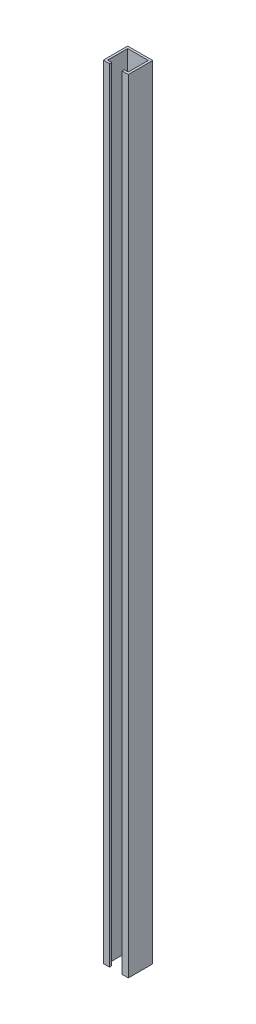
ISO-10303-21;
HEADER;
FILE_DESCRIPTION(('STEP AP214'),'2;1');
FILE_NAME('part.step','',(''),(''),'','','');
FILE_SCHEMA(('AUTOMOTIVE_DESIGN { 1 0 10303 214 1 1 1 1 }'));
ENDSEC;
DATA;
#1=APPLICATION_CONTEXT('core data for automotive mechanical design processes');
#2=APPLICATION_PROTOCOL_DEFINITION('international standard','automotive_design',2000,#1);
#3=PRODUCT_CONTEXT('',#1,'mechanical');
#4=PRODUCT('Part','Part','',(#3));
#5=PRODUCT_RELATED_PRODUCT_CATEGORY('part','',(#4));
#6=PRODUCT_DEFINITION_FORMATION('','',#4);
#7=PRODUCT_DEFINITION_CONTEXT('part definition',#1,'design');
#8=PRODUCT_DEFINITION('design','',#6,#7);
#9=PRODUCT_DEFINITION_SHAPE('','',#8);
#10=(LENGTH_UNIT() NAMED_UNIT(*) SI_UNIT(.MILLI.,.METRE.));
#11=(NAMED_UNIT(*) PLANE_ANGLE_UNIT() SI_UNIT($,.RADIAN.));
#12=(NAMED_UNIT(*) SI_UNIT($,.STERADIAN.) SOLID_ANGLE_UNIT());
#13=UNCERTAINTY_MEASURE_WITH_UNIT(LENGTH_MEASURE(1.E-05),#10,'distance_accuracy_value','');
#14=(GEOMETRIC_REPRESENTATION_CONTEXT(3) GLOBAL_UNCERTAINTY_ASSIGNED_CONTEXT((#13)) GLOBAL_UNIT_ASSIGNED_CONTEXT((#10,
#11,#12)) REPRESENTATION_CONTEXT('',''));
#15=CARTESIAN_POINT('',(0.,0.,0.));
#16=DIRECTION('',(0.,0.,1.));
#17=DIRECTION('',(1.,0.,0.));
#18=AXIS2_PLACEMENT_3D('',#15,#16,#17);
#19=CARTESIAN_POINT('',(9.5,360.,-20.4566609030179));
#20=DIRECTION('',(1.,0.,0.));
#21=DIRECTION('',(0.,0.,-1.));
#22=AXIS2_PLACEMENT_3D('',#19,#20,#21);
#23=PLANE('',#22);
#24=DIRECTION('',(0.,0.,1.));
#25=VECTOR('',#24,1.);
#26=CARTESIAN_POINT('',(9.5,-360.,-20.4566609030179));
#27=LINE('',#26,#25);
#28=CARTESIAN_POINT('',(9.5,-360.,-20.4566609030179));
#29=VERTEX_POINT('',#28);
#30=CARTESIAN_POINT('',(9.5,-360.,-2.));
#31=VERTEX_POINT('',#30);
#32=EDGE_CURVE('E164',#29,#31,#27,.T.);
#33=ORIENTED_EDGE('',*,*,#32,.T.);
#34=DIRECTION('',(0.,-1.,0.));
#35=VECTOR('',#34,1.);
#36=CARTESIAN_POINT('',(9.5,360.,-2.));
#37=LINE('',#36,#35);
#38=CARTESIAN_POINT('',(9.5,360.,-2.));
#39=VERTEX_POINT('',#38);
#40=EDGE_CURVE('E11',#39,#31,#37,.T.);
#41=ORIENTED_EDGE('',*,*,#40,.F.);
#42=DIRECTION('',(0.,0.,1.));
#43=VECTOR('',#42,1.);
#44=CARTESIAN_POINT('',(9.5,360.,-20.4566609030179));
#45=LINE('',#44,#43);
#46=CARTESIAN_POINT('',(9.5,360.,-20.4566609030179));
#47=VERTEX_POINT('',#46);
#48=EDGE_CURVE('E198',#47,#39,#45,.T.);
#49=ORIENTED_EDGE('',*,*,#48,.F.);
#50=DIRECTION('',(0.,-1.,0.));
#51=VECTOR('',#50,1.);
#52=CARTESIAN_POINT('',(9.5,360.,-20.4566609030179));
#53=LINE('',#52,#51);
#54=EDGE_CURVE('E160',#47,#29,#53,.T.);
#55=ORIENTED_EDGE('',*,*,#54,.T.);
#56=EDGE_LOOP('',(#33,#41,#49,#55));
#57=FACE_BOUND('',#56,.T.);
#58=ADVANCED_FACE('F39',(#57),#23,.F.);
#59=CARTESIAN_POINT('',(9.5,360.,-2.));
#60=DIRECTION('',(0.,0.,1.));
#61=DIRECTION('',(1.,0.,0.));
#62=AXIS2_PLACEMENT_3D('',#59,#60,#61);
#63=PLANE('',#62);
#64=DIRECTION('',(-1.,0.,0.));
#65=VECTOR('',#64,1.);
#66=CARTESIAN_POINT('',(9.5,-360.,-2.));
#67=LINE('',#66,#65);
#68=CARTESIAN_POINT('',(5.75,-360.,-2.));
#69=VERTEX_POINT('',#68);
#70=EDGE_CURVE('E168',#31,#69,#67,.T.);
#71=ORIENTED_EDGE('',*,*,#70,.T.);
#72=DIRECTION('',(0.,-1.,0.));
#73=VECTOR('',#72,1.);
#74=CARTESIAN_POINT('',(5.75,360.,-2.));
#75=LINE('',#74,#73);
#76=CARTESIAN_POINT('',(5.75,360.,-2.));
#77=VERTEX_POINT('',#76);
#78=EDGE_CURVE('E48',#77,#69,#75,.T.);
#79=ORIENTED_EDGE('',*,*,#78,.F.);
#80=DIRECTION('',(-1.,0.,0.));
#81=VECTOR('',#80,1.);
#82=CARTESIAN_POINT('',(9.5,360.,-2.));
#83=LINE('',#82,#81);
#84=EDGE_CURVE('E111',#39,#77,#83,.T.);
#85=ORIENTED_EDGE('',*,*,#84,.F.);
#86=ORIENTED_EDGE('',*,*,#40,.T.);
#87=EDGE_LOOP('',(#71,#79,#85,#86));
#88=FACE_BOUND('',#87,.T.);
#89=ADVANCED_FACE('F292',(#88),#63,.F.);
#90=CARTESIAN_POINT('',(5.75,360.,0.));
#91=DIRECTION('',(1.,0.,0.));
#92=DIRECTION('',(0.,0.,-1.));
#93=AXIS2_PLACEMENT_3D('',#90,#91,#92);
#94=PLANE('',#93);
#95=DIRECTION('',(0.,0.,1.));
#96=VECTOR('',#95,1.);
#97=CARTESIAN_POINT('',(5.75,-360.,0.));
#98=LINE('',#97,#96);
#99=CARTESIAN_POINT('',(5.75,-360.,0.));
#100=VERTEX_POINT('',#99);
#101=EDGE_CURVE('E171',#69,#100,#98,.T.);
#102=ORIENTED_EDGE('',*,*,#101,.T.);
#103=DIRECTION('',(0.,-1.,0.));
#104=VECTOR('',#103,1.);
#105=CARTESIAN_POINT('',(5.75,360.,0.));
#106=LINE('',#105,#104);
#107=CARTESIAN_POINT('',(5.75,360.,0.));
#108=VERTEX_POINT('',#107);
#109=EDGE_CURVE('E225',#108,#100,#106,.T.);
#110=ORIENTED_EDGE('',*,*,#109,.F.);
#111=DIRECTION('',(0.,0.,1.));
#112=VECTOR('',#111,1.);
#113=CARTESIAN_POINT('',(5.75,360.,0.));
#114=LINE('',#113,#112);
#115=EDGE_CURVE('E235',#77,#108,#114,.T.);
#116=ORIENTED_EDGE('',*,*,#115,.F.);
#117=ORIENTED_EDGE('',*,*,#78,.T.);
#118=EDGE_LOOP('',(#102,#110,#116,#117));
#119=FACE_BOUND('',#118,.T.);
#120=ADVANCED_FACE('F233',(#119),#94,.F.);
#121=CARTESIAN_POINT('',(11.5,360.,0.));
#122=DIRECTION('',(0.,0.,-1.));
#123=DIRECTION('',(-1.,0.,0.));
#124=AXIS2_PLACEMENT_3D('',#121,#122,#123);
#125=PLANE('',#124);
#126=DIRECTION('',(1.,0.,0.));
#127=VECTOR('',#126,1.);
#128=CARTESIAN_POINT('',(11.5,-360.,0.));
#129=LINE('',#128,#127);
#130=CARTESIAN_POINT('',(11.5,-360.,0.));
#131=VERTEX_POINT('',#130);
#132=EDGE_CURVE('E174',#100,#131,#129,.T.);
#133=ORIENTED_EDGE('',*,*,#132,.T.);
#134=DIRECTION('',(0.,-1.,0.));
#135=VECTOR('',#134,1.);
#136=CARTESIAN_POINT('',(11.5,360.,0.));
#137=LINE('',#136,#135);
#138=CARTESIAN_POINT('',(11.5,360.,0.));
#139=VERTEX_POINT('',#138);
#140=EDGE_CURVE('E221',#139,#131,#137,.T.);
#141=ORIENTED_EDGE('',*,*,#140,.F.);
#142=DIRECTION('',(1.,0.,0.));
#143=VECTOR('',#142,1.);
#144=CARTESIAN_POINT('',(11.5,360.,0.));
#145=LINE('',#144,#143);
#146=EDGE_CURVE('E254',#108,#139,#145,.T.);
#147=ORIENTED_EDGE('',*,*,#146,.F.);
#148=ORIENTED_EDGE('',*,*,#109,.T.);
#149=EDGE_LOOP('',(#133,#141,#147,#148));
#150=FACE_BOUND('',#149,.T.);
#151=ADVANCED_FACE('F244',(#150),#125,.F.);
#152=CARTESIAN_POINT('',(11.5,360.,-22.4566609030179));
#153=DIRECTION('',(-1.,0.,0.));
#154=DIRECTION('',(0.,0.,1.));
#155=AXIS2_PLACEMENT_3D('',#152,#153,#154);
#156=PLANE('',#155);
#157=DIRECTION('',(0.,0.,-1.));
#158=VECTOR('',#157,1.);
#159=CARTESIAN_POINT('',(11.5,-360.,-22.4566609030179));
#160=LINE('',#159,#158);
#161=CARTESIAN_POINT('',(11.5,-360.,-22.4566609030179));
#162=VERTEX_POINT('',#161);
#163=EDGE_CURVE('E177',#131,#162,#160,.T.);
#164=ORIENTED_EDGE('',*,*,#163,.T.);
#165=DIRECTION('',(0.,-1.,0.));
#166=VECTOR('',#165,1.);
#167=CARTESIAN_POINT('',(11.5,360.,-22.4566609030179));
#168=LINE('',#167,#166);
#169=CARTESIAN_POINT('',(11.5,360.,-22.4566609030179));
#170=VERTEX_POINT('',#169);
#171=EDGE_CURVE('E217',#170,#162,#168,.T.);
#172=ORIENTED_EDGE('',*,*,#171,.F.);
#173=DIRECTION('',(0.,0.,-1.));
#174=VECTOR('',#173,1.);
#175=CARTESIAN_POINT('',(11.5,360.,-22.4566609030179));
#176=LINE('',#175,#174);
#177=EDGE_CURVE('E250',#139,#170,#176,.T.);
#178=ORIENTED_EDGE('',*,*,#177,.F.);
#179=ORIENTED_EDGE('',*,*,#140,.T.);
#180=EDGE_LOOP('',(#164,#172,#178,#179));
#181=FACE_BOUND('',#180,.T.);
#182=ADVANCED_FACE('F248',(#181),#156,.F.);
#183=CARTESIAN_POINT('',(11.5,360.,-22.4566609030179));
#184=DIRECTION('',(0.,0.,1.));
#185=DIRECTION('',(1.,0.,0.));
#186=AXIS2_PLACEMENT_3D('',#183,#184,#185);
#187=PLANE('',#186);
#188=DIRECTION('',(-1.,0.,0.));
#189=VECTOR('',#188,1.);
#190=CARTESIAN_POINT('',(11.5,-360.,-22.4566609030179));
#191=LINE('',#190,#189);
#192=CARTESIAN_POINT('',(-11.5,-360.,-22.4566609030179));
#193=VERTEX_POINT('',#192);
#194=EDGE_CURVE('E180',#162,#193,#191,.T.);
#195=ORIENTED_EDGE('',*,*,#194,.T.);
#196=DIRECTION('',(0.,-1.,0.));
#197=VECTOR('',#196,1.);
#198=CARTESIAN_POINT('',(-11.5,360.,-22.4566609030179));
#199=LINE('',#198,#197);
#200=CARTESIAN_POINT('',(-11.5,360.,-22.4566609030179));
#201=VERTEX_POINT('',#200);
#202=EDGE_CURVE('E213',#201,#193,#199,.T.);
#203=ORIENTED_EDGE('',*,*,#202,.F.);
#204=DIRECTION('',(-1.,0.,0.));
#205=VECTOR('',#204,1.);
#206=CARTESIAN_POINT('',(11.5,360.,-22.4566609030179));
#207=LINE('',#206,#205);
#208=EDGE_CURVE('E253',#170,#201,#207,.T.);
#209=ORIENTED_EDGE('',*,*,#208,.F.);
#210=ORIENTED_EDGE('',*,*,#171,.T.);
#211=EDGE_LOOP('',(#195,#203,#209,#210));
#212=FACE_BOUND('',#211,.T.);
#213=ADVANCED_FACE('F305',(#212),#187,.F.);
#214=CARTESIAN_POINT('',(-11.5,360.,-22.4566609030179));
#215=DIRECTION('',(1.,0.,0.));
#216=DIRECTION('',(0.,0.,-1.));
#217=AXIS2_PLACEMENT_3D('',#214,#215,#216);
#218=PLANE('',#217);
#219=DIRECTION('',(0.,0.,1.));
#220=VECTOR('',#219,1.);
#221=CARTESIAN_POINT('',(-11.5,-360.,-22.4566609030179));
#222=LINE('',#221,#220);
#223=CARTESIAN_POINT('',(-11.5,-360.,0.));
#224=VERTEX_POINT('',#223);
#225=EDGE_CURVE('E183',#193,#224,#222,.T.);
#226=ORIENTED_EDGE('',*,*,#225,.T.);
#227=DIRECTION('',(0.,-1.,0.));
#228=VECTOR('',#227,1.);
#229=CARTESIAN_POINT('',(-11.5,360.,0.));
#230=LINE('',#229,#228);
#231=CARTESIAN_POINT('',(-11.5,360.,0.));
#232=VERTEX_POINT('',#231);
#233=EDGE_CURVE('E209',#232,#224,#230,.T.);
#234=ORIENTED_EDGE('',*,*,#233,.F.);
#235=DIRECTION('',(0.,0.,1.));
#236=VECTOR('',#235,1.);
#237=CARTESIAN_POINT('',(-11.5,360.,-22.4566609030179));
#238=LINE('',#237,#236);
#239=EDGE_CURVE('E258',#201,#232,#238,.T.);
#240=ORIENTED_EDGE('',*,*,#239,.F.);
#241=ORIENTED_EDGE('',*,*,#202,.T.);
#242=EDGE_LOOP('',(#226,#234,#240,#241));
#243=FACE_BOUND('',#242,.T.);
#244=ADVANCED_FACE('F308',(#243),#218,.F.);
#245=CARTESIAN_POINT('',(-11.5,360.,0.));
#246=DIRECTION('',(0.,0.,-1.));
#247=DIRECTION('',(-1.,0.,0.));
#248=AXIS2_PLACEMENT_3D('',#245,#246,#247);
#249=PLANE('',#248);
#250=DIRECTION('',(1.,0.,0.));
#251=VECTOR('',#250,1.);
#252=CARTESIAN_POINT('',(-11.5,-360.,0.));
#253=LINE('',#252,#251);
#254=CARTESIAN_POINT('',(-5.75,-360.,0.));
#255=VERTEX_POINT('',#254);
#256=EDGE_CURVE('E186',#224,#255,#253,.T.);
#257=ORIENTED_EDGE('',*,*,#256,.T.);
#258=DIRECTION('',(0.,-1.,0.));
#259=VECTOR('',#258,1.);
#260=CARTESIAN_POINT('',(-5.75,360.,0.));
#261=LINE('',#260,#259);
#262=CARTESIAN_POINT('',(-5.75,360.,0.));
#263=VERTEX_POINT('',#262);
#264=EDGE_CURVE('E205',#263,#255,#261,.T.);
#265=ORIENTED_EDGE('',*,*,#264,.F.);
#266=DIRECTION('',(1.,0.,0.));
#267=VECTOR('',#266,1.);
#268=CARTESIAN_POINT('',(-11.5,360.,0.));
#269=LINE('',#268,#267);
#270=EDGE_CURVE('E265',#232,#263,#269,.T.);
#271=ORIENTED_EDGE('',*,*,#270,.F.);
#272=ORIENTED_EDGE('',*,*,#233,.T.);
#273=EDGE_LOOP('',(#257,#265,#271,#272));
#274=FACE_BOUND('',#273,.T.);
#275=ADVANCED_FACE('F273',(#274),#249,.F.);
#276=CARTESIAN_POINT('',(-5.75,360.,0.));
#277=DIRECTION('',(-1.,0.,0.));
#278=DIRECTION('',(0.,0.,1.));
#279=AXIS2_PLACEMENT_3D('',#276,#277,#278);
#280=PLANE('',#279);
#281=DIRECTION('',(0.,0.,-1.));
#282=VECTOR('',#281,1.);
#283=CARTESIAN_POINT('',(-5.75,-360.,0.));
#284=LINE('',#283,#282);
#285=CARTESIAN_POINT('',(-5.75,-360.,-2.));
#286=VERTEX_POINT('',#285);
#287=EDGE_CURVE('E189',#255,#286,#284,.T.);
#288=ORIENTED_EDGE('',*,*,#287,.T.);
#289=DIRECTION('',(0.,-1.,0.));
#290=VECTOR('',#289,1.);
#291=CARTESIAN_POINT('',(-5.75,360.,-2.));
#292=LINE('',#291,#290);
#293=CARTESIAN_POINT('',(-5.75,360.,-2.));
#294=VERTEX_POINT('',#293);
#295=EDGE_CURVE('E153',#294,#286,#292,.T.);
#296=ORIENTED_EDGE('',*,*,#295,.F.);
#297=DIRECTION('',(0.,0.,-1.));
#298=VECTOR('',#297,1.);
#299=CARTESIAN_POINT('',(-5.75,360.,0.));
#300=LINE('',#299,#298);
#301=EDGE_CURVE('E142',#263,#294,#300,.T.);
#302=ORIENTED_EDGE('',*,*,#301,.F.);
#303=ORIENTED_EDGE('',*,*,#264,.T.);
#304=EDGE_LOOP('',(#288,#296,#302,#303));
#305=FACE_BOUND('',#304,.T.);
#306=ADVANCED_FACE('F277',(#305),#280,.F.);
#307=CARTESIAN_POINT('',(-9.5,360.,-2.));
#308=DIRECTION('',(0.,0.,1.));
#309=DIRECTION('',(1.,0.,0.));
#310=AXIS2_PLACEMENT_3D('',#307,#308,#309);
#311=PLANE('',#310);
#312=DIRECTION('',(-1.,0.,0.));
#313=VECTOR('',#312,1.);
#314=CARTESIAN_POINT('',(-9.5,-360.,-2.));
#315=LINE('',#314,#313);
#316=CARTESIAN_POINT('',(-9.5,-360.,-2.));
#317=VERTEX_POINT('',#316);
#318=EDGE_CURVE('E151',#286,#317,#315,.T.);
#319=ORIENTED_EDGE('',*,*,#318,.T.);
#320=DIRECTION('',(0.,-1.,0.));
#321=VECTOR('',#320,1.);
#322=CARTESIAN_POINT('',(-9.5,360.,-2.));
#323=LINE('',#322,#321);
#324=CARTESIAN_POINT('',(-9.5,360.,-2.));
#325=VERTEX_POINT('',#324);
#326=EDGE_CURVE('E148',#325,#317,#323,.T.);
#327=ORIENTED_EDGE('',*,*,#326,.F.);
#328=DIRECTION('',(-1.,0.,0.));
#329=VECTOR('',#328,1.);
#330=CARTESIAN_POINT('',(-9.5,360.,-2.));
#331=LINE('',#330,#329);
#332=EDGE_CURVE('E136',#294,#325,#331,.T.);
#333=ORIENTED_EDGE('',*,*,#332,.F.);
#334=ORIENTED_EDGE('',*,*,#295,.T.);
#335=EDGE_LOOP('',(#319,#327,#333,#334));
#336=FACE_BOUND('',#335,.T.);
#337=ADVANCED_FACE('F149',(#336),#311,.F.);
#338=CARTESIAN_POINT('',(-9.5,360.,-20.4566609030179));
#339=DIRECTION('',(-1.,0.,0.));
#340=DIRECTION('',(0.,0.,1.));
#341=AXIS2_PLACEMENT_3D('',#338,#339,#340);
#342=PLANE('',#341);
#343=DIRECTION('',(0.,0.,-1.));
#344=VECTOR('',#343,1.);
#345=CARTESIAN_POINT('',(-9.5,-360.,-20.4566609030179));
#346=LINE('',#345,#344);
#347=CARTESIAN_POINT('',(-9.5,-360.,-20.4566609030179));
#348=VERTEX_POINT('',#347);
#349=EDGE_CURVE('E97',#317,#348,#346,.T.);
#350=ORIENTED_EDGE('',*,*,#349,.T.);
#351=DIRECTION('',(0.,-1.,0.));
#352=VECTOR('',#351,1.);
#353=CARTESIAN_POINT('',(-9.5,360.,-20.4566609030179));
#354=LINE('',#353,#352);
#355=CARTESIAN_POINT('',(-9.5,360.,-20.4566609030179));
#356=VERTEX_POINT('',#355);
#357=EDGE_CURVE('E154',#356,#348,#354,.T.);
#358=ORIENTED_EDGE('',*,*,#357,.F.);
#359=DIRECTION('',(0.,0.,-1.));
#360=VECTOR('',#359,1.);
#361=CARTESIAN_POINT('',(-9.5,360.,-20.4566609030179));
#362=LINE('',#361,#360);
#363=EDGE_CURVE('E140',#325,#356,#362,.T.);
#364=ORIENTED_EDGE('',*,*,#363,.F.);
#365=ORIENTED_EDGE('',*,*,#326,.T.);
#366=EDGE_LOOP('',(#350,#358,#364,#365));
#367=FACE_BOUND('',#366,.T.);
#368=ADVANCED_FACE('F156',(#367),#342,.F.);
#369=CARTESIAN_POINT('',(9.5,360.,-20.4566609030179));
#370=DIRECTION('',(0.,0.,-1.));
#371=DIRECTION('',(-1.,0.,0.));
#372=AXIS2_PLACEMENT_3D('',#369,#370,#371);
#373=PLANE('',#372);
#374=DIRECTION('',(1.,0.,0.));
#375=VECTOR('',#374,1.);
#376=CARTESIAN_POINT('',(9.5,-360.,-20.4566609030179));
#377=LINE('',#376,#375);
#378=EDGE_CURVE('E103',#348,#29,#377,.T.);
#379=ORIENTED_EDGE('',*,*,#378,.T.);
#380=ORIENTED_EDGE('',*,*,#54,.F.);
#381=DIRECTION('',(1.,0.,0.));
#382=VECTOR('',#381,1.);
#383=CARTESIAN_POINT('',(9.5,360.,-20.4566609030179));
#384=LINE('',#383,#382);
#385=EDGE_CURVE('E56',#356,#47,#384,.T.);
#386=ORIENTED_EDGE('',*,*,#385,.F.);
#387=ORIENTED_EDGE('',*,*,#357,.T.);
#388=EDGE_LOOP('',(#379,#380,#386,#387));
#389=FACE_BOUND('',#388,.T.);
#390=ADVANCED_FACE('F281',(#389),#373,.F.);
#391=CARTESIAN_POINT('',(0.,360.,0.));
#392=DIRECTION('',(0.,-1.,0.));
#393=DIRECTION('',(0.,0.,-1.));
#394=AXIS2_PLACEMENT_3D('',#391,#392,#393);
#395=PLANE('',#394);
#396=ORIENTED_EDGE('',*,*,#48,.T.);
#397=ORIENTED_EDGE('',*,*,#84,.T.);
#398=ORIENTED_EDGE('',*,*,#115,.T.);
#399=ORIENTED_EDGE('',*,*,#146,.T.);
#400=ORIENTED_EDGE('',*,*,#177,.T.);
#401=ORIENTED_EDGE('',*,*,#208,.T.);
#402=ORIENTED_EDGE('',*,*,#239,.T.);
#403=ORIENTED_EDGE('',*,*,#270,.T.);
#404=ORIENTED_EDGE('',*,*,#301,.T.);
#405=ORIENTED_EDGE('',*,*,#332,.T.);
#406=ORIENTED_EDGE('',*,*,#363,.T.);
#407=ORIENTED_EDGE('',*,*,#385,.T.);
#408=EDGE_LOOP('',(#396,#397,#398,#399,#400,#401,#402,#403,#404,#405,#406,#407));
#409=FACE_BOUND('',#408,.T.);
#410=ADVANCED_FACE('F138',(#409),#395,.F.);
#411=CARTESIAN_POINT('',(0.,-360.,0.));
#412=DIRECTION('',(0.,-1.,0.));
#413=DIRECTION('',(0.,0.,-1.));
#414=AXIS2_PLACEMENT_3D('',#411,#412,#413);
#415=PLANE('',#414);
#416=ORIENTED_EDGE('',*,*,#32,.F.);
#417=ORIENTED_EDGE('',*,*,#378,.F.);
#418=ORIENTED_EDGE('',*,*,#349,.F.);
#419=ORIENTED_EDGE('',*,*,#318,.F.);
#420=ORIENTED_EDGE('',*,*,#287,.F.);
#421=ORIENTED_EDGE('',*,*,#256,.F.);
#422=ORIENTED_EDGE('',*,*,#225,.F.);
#423=ORIENTED_EDGE('',*,*,#194,.F.);
#424=ORIENTED_EDGE('',*,*,#163,.F.);
#425=ORIENTED_EDGE('',*,*,#132,.F.);
#426=ORIENTED_EDGE('',*,*,#101,.F.);
#427=ORIENTED_EDGE('',*,*,#70,.F.);
#428=EDGE_LOOP('',(#416,#417,#418,#419,#420,#421,#422,#423,#424,#425,#426,#427));
#429=FACE_BOUND('',#428,.T.);
#430=ADVANCED_FACE('F239',(#429),#415,.T.);
#431=CLOSED_SHELL('',(#58,#89,#120,#151,#182,#213,#244,#275,#306,#337,#368,#390,#410,#430));
#432=MANIFOLD_SOLID_BREP('B2',#431);
#433=ADVANCED_BREP_SHAPE_REPRESENTATION('',(#18,#432),#14);
#434=SHAPE_DEFINITION_REPRESENTATION(#9,#433);
ENDSEC;
END-ISO-10303-21;
